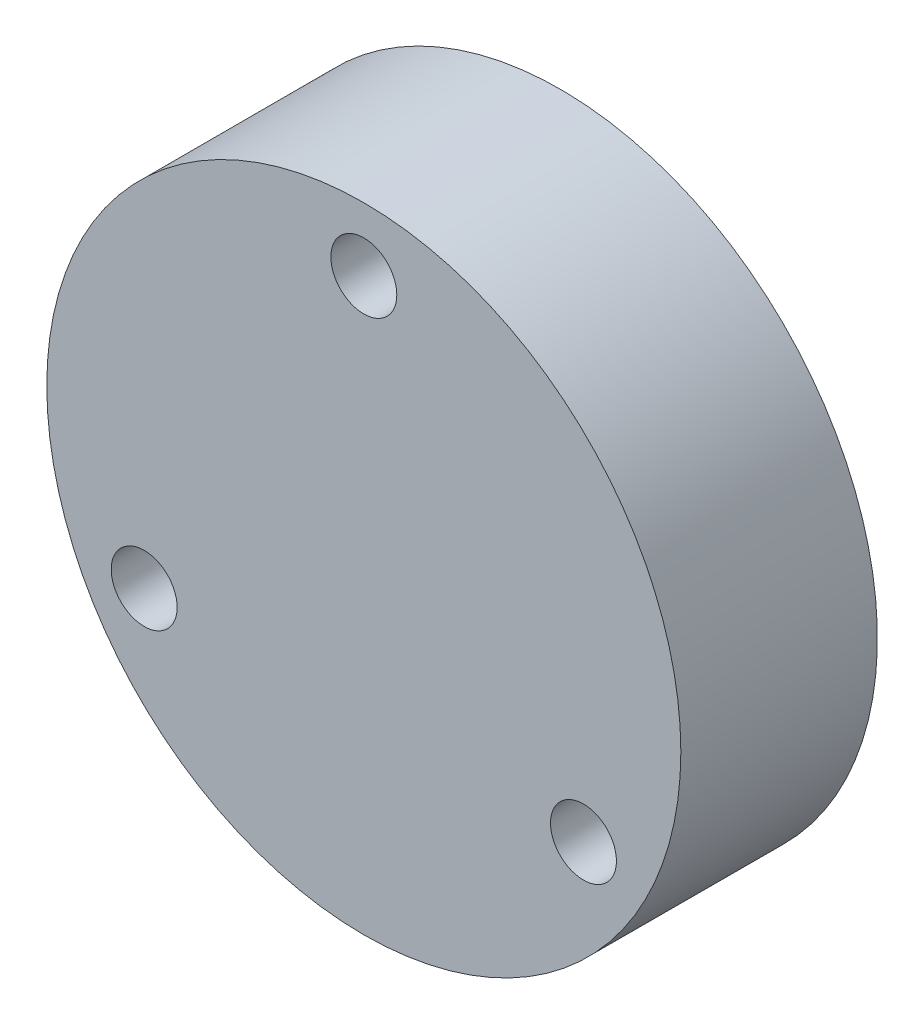
ISO-10303-21;
HEADER;
FILE_DESCRIPTION(('STEP AP214'),'2;1');
FILE_NAME('part.step','',(''),(''),'','','');
FILE_SCHEMA(('AUTOMOTIVE_DESIGN { 1 0 10303 214 1 1 1 1 }'));
ENDSEC;
DATA;
#1=APPLICATION_CONTEXT('core data for automotive mechanical design processes');
#2=APPLICATION_PROTOCOL_DEFINITION('international standard','automotive_design',2000,#1);
#3=PRODUCT_CONTEXT('',#1,'mechanical');
#4=PRODUCT('Part','Part','',(#3));
#5=PRODUCT_RELATED_PRODUCT_CATEGORY('part','',(#4));
#6=PRODUCT_DEFINITION_FORMATION('','',#4);
#7=PRODUCT_DEFINITION_CONTEXT('part definition',#1,'design');
#8=PRODUCT_DEFINITION('design','',#6,#7);
#9=PRODUCT_DEFINITION_SHAPE('','',#8);
#10=(LENGTH_UNIT() NAMED_UNIT(*) SI_UNIT(.MILLI.,.METRE.));
#11=(NAMED_UNIT(*) PLANE_ANGLE_UNIT() SI_UNIT($,.RADIAN.));
#12=(NAMED_UNIT(*) SI_UNIT($,.STERADIAN.) SOLID_ANGLE_UNIT());
#13=UNCERTAINTY_MEASURE_WITH_UNIT(LENGTH_MEASURE(1.E-05),#10,'distance_accuracy_value','');
#14=(GEOMETRIC_REPRESENTATION_CONTEXT(3) GLOBAL_UNCERTAINTY_ASSIGNED_CONTEXT((#13)) GLOBAL_UNIT_ASSIGNED_CONTEXT((#10,
#11,#12)) REPRESENTATION_CONTEXT('',''));
#15=CARTESIAN_POINT('',(0.,0.,0.));
#16=DIRECTION('',(0.,0.,1.));
#17=DIRECTION('',(1.,0.,0.));
#18=AXIS2_PLACEMENT_3D('',#15,#16,#17);
#19=CARTESIAN_POINT('',(0.,0.,4.25));
#20=DIRECTION('',(0.,0.,-1.));
#21=DIRECTION('',(-1.,0.,0.));
#22=AXIS2_PLACEMENT_3D('',#19,#20,#21);
#23=PLANE('',#22);
#24=CARTESIAN_POINT('',(-8.66025403784439,-5.,4.25));
#25=DIRECTION('',(0.,0.,-1.));
#26=DIRECTION('',(-1.,0.,0.));
#27=AXIS2_PLACEMENT_3D('',#24,#25,#26);
#28=CIRCLE('',#27,1.3);
#29=CARTESIAN_POINT('',(-9.96025403784438,-5.,4.25));
#30=VERTEX_POINT('',#29);
#31=EDGE_CURVE('E60',#30,#30,#28,.F.);
#32=ORIENTED_EDGE('',*,*,#31,.T.);
#33=EDGE_LOOP('',(#32));
#34=FACE_BOUND('',#33,.T.);
#35=CARTESIAN_POINT('',(8.66025403784439,-5.,4.25));
#36=DIRECTION('',(0.,0.,-1.));
#37=DIRECTION('',(-1.,0.,0.));
#38=AXIS2_PLACEMENT_3D('',#35,#36,#37);
#39=CIRCLE('',#38,1.3);
#40=CARTESIAN_POINT('',(7.36025403784439,-5.,4.25));
#41=VERTEX_POINT('',#40);
#42=EDGE_CURVE('E55',#41,#41,#39,.F.);
#43=ORIENTED_EDGE('',*,*,#42,.T.);
#44=EDGE_LOOP('',(#43));
#45=FACE_BOUND('',#44,.T.);
#46=CARTESIAN_POINT('',(0.,10.,4.25));
#47=DIRECTION('',(0.,0.,-1.));
#48=DIRECTION('',(-1.,0.,0.));
#49=AXIS2_PLACEMENT_3D('',#46,#47,#48);
#50=CIRCLE('',#49,1.3);
#51=CARTESIAN_POINT('',(-1.3,10.,4.25));
#52=VERTEX_POINT('',#51);
#53=EDGE_CURVE('E53',#52,#52,#50,.F.);
#54=ORIENTED_EDGE('',*,*,#53,.T.);
#55=EDGE_LOOP('',(#54));
#56=FACE_BOUND('',#55,.T.);
#57=CARTESIAN_POINT('',(0.,0.,4.25));
#58=DIRECTION('',(0.,0.,-1.));
#59=DIRECTION('',(-1.,0.,0.));
#60=AXIS2_PLACEMENT_3D('',#57,#58,#59);
#61=CIRCLE('',#60,12.5);
#62=CARTESIAN_POINT('',(-12.5,0.,4.25));
#63=VERTEX_POINT('',#62);
#64=EDGE_CURVE('E56',#63,#63,#61,.T.);
#65=ORIENTED_EDGE('',*,*,#64,.T.);
#66=EDGE_LOOP('',(#65));
#67=FACE_BOUND('',#66,.T.);
#68=CARTESIAN_POINT('',(0.,0.,4.25));
#69=DIRECTION('',(0.,0.,-1.));
#70=DIRECTION('',(-1.,0.,0.));
#71=AXIS2_PLACEMENT_3D('',#68,#69,#70);
#72=CIRCLE('',#71,6.);
#73=CARTESIAN_POINT('',(-6.,0.,4.25));
#74=VERTEX_POINT('',#73);
#75=EDGE_CURVE('E181',#74,#74,#72,.T.);
#76=ORIENTED_EDGE('',*,*,#75,.F.);
#77=EDGE_LOOP('',(#76));
#78=FACE_BOUND('',#77,.T.);
#79=ADVANCED_FACE('F32',(#34,#45,#56,#67,#78),#23,.T.);
#80=CARTESIAN_POINT('',(0.,0.,12.));
#81=DIRECTION('',(0.,0.,-1.));
#82=DIRECTION('',(-1.,0.,0.));
#83=AXIS2_PLACEMENT_3D('',#80,#81,#82);
#84=CYLINDRICAL_SURFACE('',#83,12.5);
#85=CARTESIAN_POINT('',(0.,0.,12.));
#86=DIRECTION('',(0.,0.,1.));
#87=DIRECTION('',(1.,0.,0.));
#88=AXIS2_PLACEMENT_3D('',#85,#86,#87);
#89=CIRCLE('',#88,12.5);
#90=CARTESIAN_POINT('',(12.5,0.,12.));
#91=VERTEX_POINT('',#90);
#92=EDGE_CURVE('E39',#91,#91,#89,.T.);
#93=ORIENTED_EDGE('',*,*,#92,.F.);
#94=EDGE_LOOP('',(#93));
#95=FACE_BOUND('',#94,.T.);
#96=ORIENTED_EDGE('',*,*,#64,.F.);
#97=EDGE_LOOP('',(#96));
#98=FACE_BOUND('',#97,.T.);
#99=ADVANCED_FACE('F34',(#95,#98),#84,.T.);
#100=CARTESIAN_POINT('',(-8.66025403784439,-5.,0.));
#101=DIRECTION('',(0.,0.,1.));
#102=DIRECTION('',(1.,0.,0.));
#103=AXIS2_PLACEMENT_3D('',#100,#101,#102);
#104=CYLINDRICAL_SURFACE('',#103,1.3);
#105=CARTESIAN_POINT('',(-8.66025403784439,-5.,12.));
#106=DIRECTION('',(0.,0.,1.));
#107=DIRECTION('',(1.,0.,0.));
#108=AXIS2_PLACEMENT_3D('',#105,#106,#107);
#109=CIRCLE('',#108,1.3);
#110=CARTESIAN_POINT('',(-7.36025403784438,-5.,12.));
#111=VERTEX_POINT('',#110);
#112=EDGE_CURVE('E51',#111,#111,#109,.T.);
#113=ORIENTED_EDGE('',*,*,#112,.T.);
#114=EDGE_LOOP('',(#113));
#115=FACE_BOUND('',#114,.T.);
#116=ORIENTED_EDGE('',*,*,#31,.F.);
#117=EDGE_LOOP('',(#116));
#118=FACE_BOUND('',#117,.T.);
#119=ADVANCED_FACE('F79',(#115,#118),#104,.F.);
#120=CARTESIAN_POINT('',(8.66025403784439,-5.,0.));
#121=DIRECTION('',(0.,0.,1.));
#122=DIRECTION('',(1.,0.,0.));
#123=AXIS2_PLACEMENT_3D('',#120,#121,#122);
#124=CYLINDRICAL_SURFACE('',#123,1.3);
#125=CARTESIAN_POINT('',(8.66025403784439,-5.,12.));
#126=DIRECTION('',(0.,0.,1.));
#127=DIRECTION('',(1.,0.,0.));
#128=AXIS2_PLACEMENT_3D('',#125,#126,#127);
#129=CIRCLE('',#128,1.3);
#130=CARTESIAN_POINT('',(9.96025403784439,-5.,12.));
#131=VERTEX_POINT('',#130);
#132=EDGE_CURVE('E48',#131,#131,#129,.T.);
#133=ORIENTED_EDGE('',*,*,#132,.T.);
#134=EDGE_LOOP('',(#133));
#135=FACE_BOUND('',#134,.T.);
#136=ORIENTED_EDGE('',*,*,#42,.F.);
#137=EDGE_LOOP('',(#136));
#138=FACE_BOUND('',#137,.T.);
#139=ADVANCED_FACE('F95',(#135,#138),#124,.F.);
#140=CARTESIAN_POINT('',(0.,10.,0.));
#141=DIRECTION('',(0.,0.,1.));
#142=DIRECTION('',(1.,0.,0.));
#143=AXIS2_PLACEMENT_3D('',#140,#141,#142);
#144=CYLINDRICAL_SURFACE('',#143,1.3);
#145=CARTESIAN_POINT('',(0.,10.,12.));
#146=DIRECTION('',(0.,0.,1.));
#147=DIRECTION('',(1.,0.,0.));
#148=AXIS2_PLACEMENT_3D('',#145,#146,#147);
#149=CIRCLE('',#148,1.3);
#150=CARTESIAN_POINT('',(1.3,10.,12.));
#151=VERTEX_POINT('',#150);
#152=EDGE_CURVE('E43',#151,#151,#149,.T.);
#153=ORIENTED_EDGE('',*,*,#152,.T.);
#154=EDGE_LOOP('',(#153));
#155=FACE_BOUND('',#154,.T.);
#156=ORIENTED_EDGE('',*,*,#53,.F.);
#157=EDGE_LOOP('',(#156));
#158=FACE_BOUND('',#157,.T.);
#159=ADVANCED_FACE('F85',(#155,#158),#144,.F.);
#160=CARTESIAN_POINT('',(0.,0.,12.));
#161=DIRECTION('',(0.,0.,1.));
#162=DIRECTION('',(1.,0.,0.));
#163=AXIS2_PLACEMENT_3D('',#160,#161,#162);
#164=PLANE('',#163);
#165=ORIENTED_EDGE('',*,*,#152,.F.);
#166=EDGE_LOOP('',(#165));
#167=FACE_BOUND('',#166,.T.);
#168=ORIENTED_EDGE('',*,*,#132,.F.);
#169=EDGE_LOOP('',(#168));
#170=FACE_BOUND('',#169,.T.);
#171=ORIENTED_EDGE('',*,*,#112,.F.);
#172=EDGE_LOOP('',(#171));
#173=FACE_BOUND('',#172,.T.);
#174=ORIENTED_EDGE('',*,*,#92,.T.);
#175=EDGE_LOOP('',(#174));
#176=FACE_BOUND('',#175,.T.);
#177=ADVANCED_FACE('F82',(#167,#170,#173,#176),#164,.T.);
#178=CARTESIAN_POINT('',(0.,0.,3.25));
#179=DIRECTION('',(0.,0.,-1.));
#180=DIRECTION('',(-1.,0.,0.));
#181=AXIS2_PLACEMENT_3D('',#178,#179,#180);
#182=PLANE('',#181);
#183=CARTESIAN_POINT('',(0.,0.,3.25));
#184=DIRECTION('',(0.,0.,-1.));
#185=DIRECTION('',(-1.,0.,0.));
#186=AXIS2_PLACEMENT_3D('',#183,#184,#185);
#187=CIRCLE('',#186,6.);
#188=CARTESIAN_POINT('',(-6.,0.,3.25));
#189=VERTEX_POINT('',#188);
#190=EDGE_CURVE('E68',#189,#189,#187,.T.);
#191=ORIENTED_EDGE('',*,*,#190,.T.);
#192=EDGE_LOOP('',(#191));
#193=FACE_BOUND('',#192,.T.);
#194=CARTESIAN_POINT('',(0.,0.,3.25));
#195=DIRECTION('',(0.,0.,-1.));
#196=DIRECTION('',(-1.,0.,0.));
#197=AXIS2_PLACEMENT_3D('',#194,#195,#196);
#198=CIRCLE('',#197,5.);
#199=CARTESIAN_POINT('',(-5.,0.,3.25));
#200=VERTEX_POINT('',#199);
#201=EDGE_CURVE('E10',#200,#200,#198,.F.);
#202=ORIENTED_EDGE('',*,*,#201,.T.);
#203=EDGE_LOOP('',(#202));
#204=FACE_BOUND('',#203,.T.);
#205=ADVANCED_FACE('F84',(#193,#204),#182,.T.);
#206=CARTESIAN_POINT('',(0.,0.,3.25));
#207=DIRECTION('',(0.,0.,1.));
#208=DIRECTION('',(1.,0.,0.));
#209=AXIS2_PLACEMENT_3D('',#206,#207,#208);
#210=CYLINDRICAL_SURFACE('',#209,6.);
#211=ORIENTED_EDGE('',*,*,#190,.F.);
#212=EDGE_LOOP('',(#211));
#213=FACE_BOUND('',#212,.T.);
#214=ORIENTED_EDGE('',*,*,#75,.T.);
#215=EDGE_LOOP('',(#214));
#216=FACE_BOUND('',#215,.T.);
#217=ADVANCED_FACE('F92',(#213,#216),#210,.T.);
#218=CARTESIAN_POINT('',(0.,0.,0.));
#219=DIRECTION('',(0.,0.,1.));
#220=DIRECTION('',(1.,0.,0.));
#221=AXIS2_PLACEMENT_3D('',#218,#219,#220);
#222=PLANE('',#221);
#223=CARTESIAN_POINT('',(0.,0.,0.));
#224=DIRECTION('',(0.,0.,-1.));
#225=DIRECTION('',(-1.,0.,0.));
#226=AXIS2_PLACEMENT_3D('',#223,#224,#225);
#227=CIRCLE('',#226,5.);
#228=CARTESIAN_POINT('',(-5.,0.,0.));
#229=VERTEX_POINT('',#228);
#230=EDGE_CURVE('E63',#229,#229,#227,.T.);
#231=ORIENTED_EDGE('',*,*,#230,.T.);
#232=EDGE_LOOP('',(#231));
#233=FACE_BOUND('',#232,.T.);
#234=ADVANCED_FACE('F133',(#233),#222,.F.);
#235=CARTESIAN_POINT('',(0.,0.,4.25));
#236=DIRECTION('',(0.,0.,-1.));
#237=DIRECTION('',(-1.,0.,0.));
#238=AXIS2_PLACEMENT_3D('',#235,#236,#237);
#239=CYLINDRICAL_SURFACE('',#238,5.);
#240=ORIENTED_EDGE('',*,*,#201,.F.);
#241=EDGE_LOOP('',(#240));
#242=FACE_BOUND('',#241,.T.);
#243=ORIENTED_EDGE('',*,*,#230,.F.);
#244=EDGE_LOOP('',(#243));
#245=FACE_BOUND('',#244,.T.);
#246=ADVANCED_FACE('F110',(#242,#245),#239,.T.);
#247=CLOSED_SHELL('',(#79,#99,#119,#139,#159,#177,#205,#217,#234,#246));
#248=MANIFOLD_SOLID_BREP('B2',#247);
#249=ADVANCED_BREP_SHAPE_REPRESENTATION('',(#18,#248),#14);
#250=SHAPE_DEFINITION_REPRESENTATION(#9,#249);
ENDSEC;
END-ISO-10303-21;
